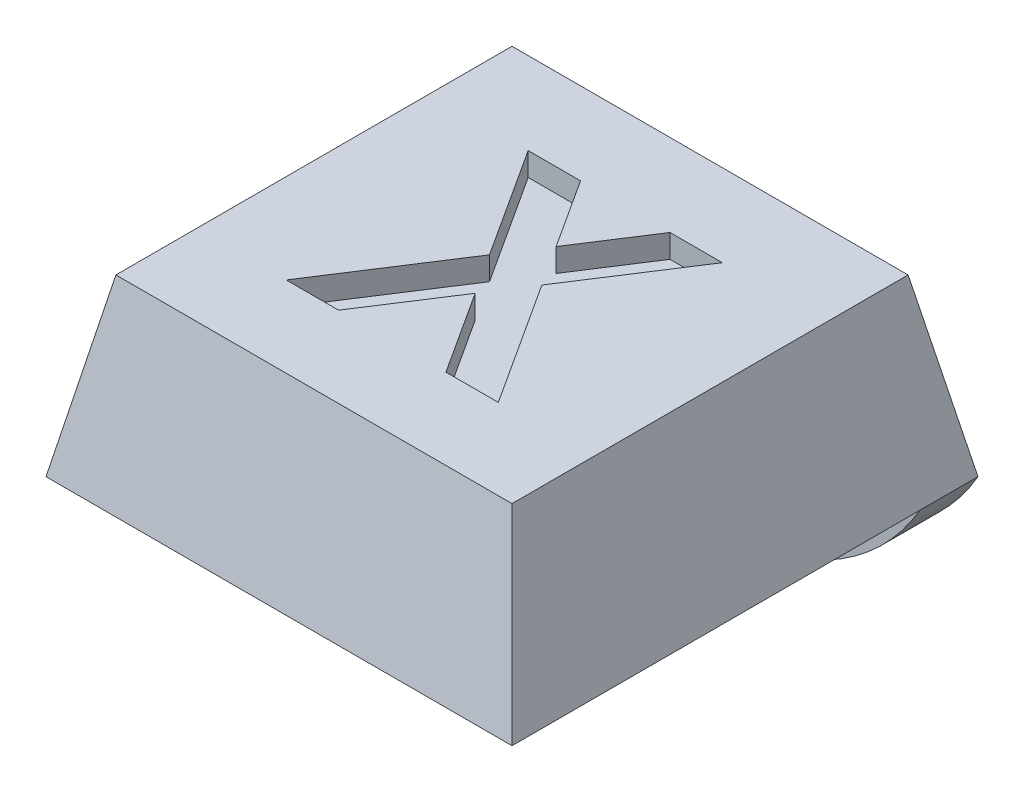
ISO-10303-21;
HEADER;
FILE_DESCRIPTION(('STEP AP214'),'2;1');
FILE_NAME('part.step','',(''),(''),'','','');
FILE_SCHEMA(('AUTOMOTIVE_DESIGN { 1 0 10303 214 1 1 1 1 }'));
ENDSEC;
DATA;
#1=APPLICATION_CONTEXT('core data for automotive mechanical design processes');
#2=APPLICATION_PROTOCOL_DEFINITION('international standard','automotive_design',2000,#1);
#3=PRODUCT_CONTEXT('',#1,'mechanical');
#4=PRODUCT('Part','Part','',(#3));
#5=PRODUCT_RELATED_PRODUCT_CATEGORY('part','',(#4));
#6=PRODUCT_DEFINITION_FORMATION('','',#4);
#7=PRODUCT_DEFINITION_CONTEXT('part definition',#1,'design');
#8=PRODUCT_DEFINITION('design','',#6,#7);
#9=PRODUCT_DEFINITION_SHAPE('','',#8);
#10=(LENGTH_UNIT() NAMED_UNIT(*) SI_UNIT(.MILLI.,.METRE.));
#11=(NAMED_UNIT(*) PLANE_ANGLE_UNIT() SI_UNIT($,.RADIAN.));
#12=(NAMED_UNIT(*) SI_UNIT($,.STERADIAN.) SOLID_ANGLE_UNIT());
#13=UNCERTAINTY_MEASURE_WITH_UNIT(LENGTH_MEASURE(1.E-05),#10,'distance_accuracy_value','');
#14=(GEOMETRIC_REPRESENTATION_CONTEXT(3) GLOBAL_UNCERTAINTY_ASSIGNED_CONTEXT((#13)) GLOBAL_UNIT_ASSIGNED_CONTEXT((#10,
#11,#12)) REPRESENTATION_CONTEXT('',''));
#15=CARTESIAN_POINT('',(0.,0.,0.));
#16=DIRECTION('',(0.,0.,1.));
#17=DIRECTION('',(1.,0.,0.));
#18=AXIS2_PLACEMENT_3D('',#15,#16,#17);
#19=CARTESIAN_POINT('',(0.,3.,0.));
#20=DIRECTION('',(0.,-1.,0.));
#21=DIRECTION('',(0.,0.,-1.));
#22=AXIS2_PLACEMENT_3D('',#19,#20,#21);
#23=PLANE('',#22);
#24=DIRECTION('',(-1.,0.,0.));
#25=VECTOR('',#24,1.);
#26=CARTESIAN_POINT('',(11.,3.,-0.6));
#27=LINE('',#26,#25);
#28=CARTESIAN_POINT('',(7.4,3.,-0.6));
#29=VERTEX_POINT('',#28);
#30=CARTESIAN_POINT('',(0.6,3.,-0.6));
#31=VERTEX_POINT('',#30);
#32=EDGE_CURVE('E230',#29,#31,#27,.T.);
#33=ORIENTED_EDGE('',*,*,#32,.F.);
#34=DIRECTION('',(0.,0.,1.));
#35=VECTOR('',#34,1.);
#36=CARTESIAN_POINT('',(7.4,3.,-8.));
#37=LINE('',#36,#35);
#38=CARTESIAN_POINT('',(7.4,3.,-7.4));
#39=VERTEX_POINT('',#38);
#40=EDGE_CURVE('E243',#39,#29,#37,.T.);
#41=ORIENTED_EDGE('',*,*,#40,.F.);
#42=DIRECTION('',(-1.,0.,0.));
#43=VECTOR('',#42,1.);
#44=CARTESIAN_POINT('',(11.,3.,-7.4));
#45=LINE('',#44,#43);
#46=CARTESIAN_POINT('',(0.599999999999999,3.,-7.4));
#47=VERTEX_POINT('',#46);
#48=EDGE_CURVE('E226',#39,#47,#45,.T.);
#49=ORIENTED_EDGE('',*,*,#48,.T.);
#50=DIRECTION('',(0.,0.,1.));
#51=VECTOR('',#50,1.);
#52=CARTESIAN_POINT('',(0.6,3.,-8.));
#53=LINE('',#52,#51);
#54=EDGE_CURVE('E246',#47,#31,#53,.T.);
#55=ORIENTED_EDGE('',*,*,#54,.T.);
#56=EDGE_LOOP('',(#33,#41,#49,#55));
#57=FACE_BOUND('',#56,.T.);
#58=DIRECTION('',(-1.,0.,0.));
#59=VECTOR('',#58,1.);
#60=CARTESIAN_POINT('',(3.03551556297444,3.,-1.98743460523464));
#61=LINE('',#60,#59);
#62=CARTESIAN_POINT('',(3.03551556297444,3.,-1.98743460523464));
#63=VERTEX_POINT('',#62);
#64=CARTESIAN_POINT('',(2.13647710143598,3.,-1.98743460523464));
#65=VERTEX_POINT('',#64);
#66=EDGE_CURVE('E59',#63,#65,#61,.T.);
#67=ORIENTED_EDGE('',*,*,#66,.T.);
#68=DIRECTION('',(0.543290774968153,0.,-0.839544599074107));
#69=VECTOR('',#68,1.);
#70=CARTESIAN_POINT('',(2.13647710143598,3.,-1.98743460523464));
#71=LINE('',#70,#69);
#72=CARTESIAN_POINT('',(3.50747069117957,3.,-4.10602434882438));
#73=VERTEX_POINT('',#72);
#74=EDGE_CURVE('E198',#65,#73,#71,.T.);
#75=ORIENTED_EDGE('',*,*,#74,.T.);
#76=DIRECTION('',(-0.543177141809505,0.,-0.839618123086714));
#77=VECTOR('',#76,1.);
#78=CARTESIAN_POINT('',(3.50747069117957,3.,-4.10602434882438));
#79=LINE('',#78,#77);
#80=CARTESIAN_POINT('',(2.29032325528213,3.,-5.98743460523464));
#81=VERTEX_POINT('',#80);
#82=EDGE_CURVE('E667',#73,#81,#79,.T.);
#83=ORIENTED_EDGE('',*,*,#82,.T.);
#84=DIRECTION('',(1.,0.,0.));
#85=VECTOR('',#84,1.);
#86=CARTESIAN_POINT('',(2.29032325528213,3.,-5.98743460523464));
#87=LINE('',#86,#85);
#88=CARTESIAN_POINT('',(3.18936171682059,3.,-5.98743460523464));
#89=VERTEX_POINT('',#88);
#90=EDGE_CURVE('E669',#81,#89,#87,.T.);
#91=ORIENTED_EDGE('',*,*,#90,.T.);
#92=DIRECTION('',(0.543133735363525,0.,0.839646202581816));
#93=VECTOR('',#92,1.);
#94=CARTESIAN_POINT('',(3.18936171682059,3.,-5.98743460523464));
#95=LINE('',#94,#93);
#96=CARTESIAN_POINT('',(3.9569899219488,3.,-4.80073588728592));
#97=VERTEX_POINT('',#96);
#98=EDGE_CURVE('E674',#89,#97,#95,.T.);
#99=ORIENTED_EDGE('',*,*,#98,.T.);
#100=DIRECTION('',(0.543133735363525,0.,-0.839646202581816));
#101=VECTOR('',#100,1.);
#102=CARTESIAN_POINT('',(3.9569899219488,3.,-4.80073588728592));
#103=LINE('',#102,#101);
#104=CARTESIAN_POINT('',(4.724618127077,3.,-5.98743460523464));
#105=VERTEX_POINT('',#104);
#106=EDGE_CURVE('E684',#97,#105,#103,.T.);
#107=ORIENTED_EDGE('',*,*,#106,.T.);
#108=DIRECTION('',(1.,0.,0.));
#109=VECTOR('',#108,1.);
#110=CARTESIAN_POINT('',(4.724618127077,3.,-5.98743460523464));
#111=LINE('',#110,#109);
#112=CARTESIAN_POINT('',(5.62365658861547,3.,-5.98743460523464));
#113=VERTEX_POINT('',#112);
#114=EDGE_CURVE('E688',#105,#113,#111,.T.);
#115=ORIENTED_EDGE('',*,*,#114,.T.);
#116=DIRECTION('',(-0.543177141809505,0.,0.839618123086714));
#117=VECTOR('',#116,1.);
#118=CARTESIAN_POINT('',(5.62365658861547,3.,-5.98743460523464));
#119=LINE('',#118,#117);
#120=CARTESIAN_POINT('',(4.40650915271803,3.,-4.10602434882438));
#121=VERTEX_POINT('',#120);
#122=EDGE_CURVE('E692',#113,#121,#119,.T.);
#123=ORIENTED_EDGE('',*,*,#122,.T.);
#124=DIRECTION('',(0.543290774968153,0.,0.839544599074107));
#125=VECTOR('',#124,1.);
#126=CARTESIAN_POINT('',(4.40650915271803,3.,-4.10602434882438));
#127=LINE('',#126,#125);
#128=CARTESIAN_POINT('',(5.77750274246162,3.,-1.98743460523464));
#129=VERTEX_POINT('',#128);
#130=EDGE_CURVE('E633',#121,#129,#127,.T.);
#131=ORIENTED_EDGE('',*,*,#130,.T.);
#132=DIRECTION('',(-1.,0.,0.));
#133=VECTOR('',#132,1.);
#134=CARTESIAN_POINT('',(5.77750274246162,3.,-1.98743460523464));
#135=LINE('',#134,#133);
#136=CARTESIAN_POINT('',(4.87846428092316,3.,-1.98743460523464));
#137=VERTEX_POINT('',#136);
#138=EDGE_CURVE('E628',#129,#137,#135,.T.);
#139=ORIENTED_EDGE('',*,*,#138,.T.);
#140=DIRECTION('',(-0.543310044190695,0.,-0.839532129153795));
#141=VECTOR('',#140,1.);
#142=CARTESIAN_POINT('',(4.87846428092316,3.,-1.98743460523464));
#143=LINE('',#142,#141);
#144=CARTESIAN_POINT('',(3.9569899219488,3.,-3.41131281036285));
#145=VERTEX_POINT('',#144);
#146=EDGE_CURVE('E622',#137,#145,#143,.T.);
#147=ORIENTED_EDGE('',*,*,#146,.T.);
#148=DIRECTION('',(-0.543310044190695,0.,0.839532129153795));
#149=VECTOR('',#148,1.);
#150=CARTESIAN_POINT('',(3.9569899219488,3.,-3.41131281036285));
#151=LINE('',#150,#149);
#152=EDGE_CURVE('E194',#145,#63,#151,.T.);
#153=ORIENTED_EDGE('',*,*,#152,.T.);
#154=EDGE_LOOP('',(#67,#75,#83,#91,#99,#107,#115,#123,#131,#139,#147,#153));
#155=FACE_BOUND('',#154,.T.);
#156=ADVANCED_FACE('F43',(#57,#155),#23,.F.);
#157=CARTESIAN_POINT('',(8.,0.,-8.));
#158=DIRECTION('',(-0.98058067569092,-0.196116135138184,0.));
#159=DIRECTION('',(0.196116135138184,-0.98058067569092,0.));
#160=AXIS2_PLACEMENT_3D('',#157,#158,#159);
#161=PLANE('',#160);
#162=DIRECTION('',(-0.192450089729875,0.962250448649376,-0.192450089729875));
#163=VECTOR('',#162,1.);
#164=CARTESIAN_POINT('',(7.7037037037037,1.48148148148148,-0.296296296296296));
#165=LINE('',#164,#163);
#166=CARTESIAN_POINT('',(8.,0.,0.));
#167=VERTEX_POINT('',#166);
#168=EDGE_CURVE('E240',#167,#29,#165,.T.);
#169=ORIENTED_EDGE('',*,*,#168,.F.);
#170=DIRECTION('',(0.,0.,-1.));
#171=VECTOR('',#170,1.);
#172=CARTESIAN_POINT('',(8.,0.,0.));
#173=LINE('',#172,#171);
#174=CARTESIAN_POINT('',(8.,0.,-7.));
#175=VERTEX_POINT('',#174);
#176=EDGE_CURVE('E259',#167,#175,#173,.T.);
#177=ORIENTED_EDGE('',*,*,#176,.T.);
#178=DIRECTION('',(0.,0.,1.));
#179=VECTOR('',#178,1.);
#180=CARTESIAN_POINT('',(8.,0.,-8.));
#181=LINE('',#180,#179);
#182=CARTESIAN_POINT('',(8.,0.,-8.));
#183=VERTEX_POINT('',#182);
#184=EDGE_CURVE('E200',#183,#175,#181,.T.);
#185=ORIENTED_EDGE('',*,*,#184,.F.);
#186=DIRECTION('',(0.192450089729875,-0.962250448649376,-0.192450089729875));
#187=VECTOR('',#186,1.);
#188=CARTESIAN_POINT('',(8.,0.,-8.));
#189=LINE('',#188,#187);
#190=EDGE_CURVE('E233',#39,#183,#189,.T.);
#191=ORIENTED_EDGE('',*,*,#190,.F.);
#192=ORIENTED_EDGE('',*,*,#40,.T.);
#193=EDGE_LOOP('',(#169,#177,#185,#191,#192));
#194=FACE_BOUND('',#193,.T.);
#195=ADVANCED_FACE('F327',(#194),#161,.F.);
#196=CARTESIAN_POINT('',(0.,0.,-8.));
#197=DIRECTION('',(0.98058067569092,-0.196116135138184,0.));
#198=DIRECTION('',(0.196116135138184,0.98058067569092,0.));
#199=AXIS2_PLACEMENT_3D('',#196,#197,#198);
#200=PLANE('',#199);
#201=DIRECTION('',(-0.192450089729875,-0.962250448649376,0.192450089729875));
#202=VECTOR('',#201,1.);
#203=CARTESIAN_POINT('',(0.296296296296296,1.48148148148148,-0.296296296296296));
#204=LINE('',#203,#202);
#205=CARTESIAN_POINT('',(0.,0.,0.));
#206=VERTEX_POINT('',#205);
#207=EDGE_CURVE('E287',#31,#206,#204,.T.);
#208=ORIENTED_EDGE('',*,*,#207,.F.);
#209=ORIENTED_EDGE('',*,*,#54,.F.);
#210=DIRECTION('',(0.192450089729875,0.962250448649376,0.192450089729875));
#211=VECTOR('',#210,1.);
#212=CARTESIAN_POINT('',(0.,0.,-8.));
#213=LINE('',#212,#211);
#214=CARTESIAN_POINT('',(0.,0.,-8.));
#215=VERTEX_POINT('',#214);
#216=EDGE_CURVE('E258',#215,#47,#213,.T.);
#217=ORIENTED_EDGE('',*,*,#216,.F.);
#218=DIRECTION('',(0.,0.,1.));
#219=VECTOR('',#218,1.);
#220=CARTESIAN_POINT('',(0.,0.,0.));
#221=LINE('',#220,#219);
#222=CARTESIAN_POINT('',(0.,0.,-7.));
#223=VERTEX_POINT('',#222);
#224=EDGE_CURVE('E263',#215,#223,#221,.T.);
#225=ORIENTED_EDGE('',*,*,#224,.T.);
#226=EDGE_CURVE('E250',#223,#206,#221,.T.);
#227=ORIENTED_EDGE('',*,*,#226,.T.);
#228=EDGE_LOOP('',(#208,#209,#217,#225,#227));
#229=FACE_BOUND('',#228,.T.);
#230=ADVANCED_FACE('F311',(#229),#200,.F.);
#231=CARTESIAN_POINT('',(0.,0.,0.));
#232=DIRECTION('',(0.,-1.,0.));
#233=DIRECTION('',(0.,0.,-1.));
#234=AXIS2_PLACEMENT_3D('',#231,#232,#233);
#235=PLANE('',#234);
#236=DIRECTION('',(-1.,0.,0.));
#237=VECTOR('',#236,1.);
#238=CARTESIAN_POINT('',(0.,0.,-7.));
#239=LINE('',#238,#237);
#240=EDGE_CURVE('E206',#175,#223,#239,.T.);
#241=ORIENTED_EDGE('',*,*,#240,.F.);
#242=ORIENTED_EDGE('',*,*,#176,.F.);
#243=DIRECTION('',(1.,0.,0.));
#244=VECTOR('',#243,1.);
#245=CARTESIAN_POINT('',(0.,0.,0.));
#246=LINE('',#245,#244);
#247=EDGE_CURVE('E260',#206,#167,#246,.T.);
#248=ORIENTED_EDGE('',*,*,#247,.F.);
#249=ORIENTED_EDGE('',*,*,#226,.F.);
#250=EDGE_LOOP('',(#241,#242,#248,#249));
#251=FACE_BOUND('',#250,.T.);
#252=CARTESIAN_POINT('',(4.,0.,-3.75));
#253=DIRECTION('',(0.,-1.,0.));
#254=DIRECTION('',(0.,0.,-1.));
#255=AXIS2_PLACEMENT_3D('',#252,#253,#254);
#256=CIRCLE('',#255,1.75);
#257=CARTESIAN_POINT('',(4.,0.,-5.5));
#258=VERTEX_POINT('',#257);
#259=EDGE_CURVE('E218',#258,#258,#256,.T.);
#260=ORIENTED_EDGE('',*,*,#259,.F.);
#261=EDGE_LOOP('',(#260));
#262=FACE_BOUND('',#261,.T.);
#263=ADVANCED_FACE('F322',(#251,#262),#235,.T.);
#264=CARTESIAN_POINT('',(11.,3.,-7.4));
#265=DIRECTION('',(0.,0.196116135138184,-0.98058067569092));
#266=DIRECTION('',(0.,0.98058067569092,0.196116135138184));
#267=AXIS2_PLACEMENT_3D('',#264,#265,#266);
#268=PLANE('',#267);
#269=ORIENTED_EDGE('',*,*,#190,.T.);
#270=DIRECTION('',(-1.,0.,0.));
#271=VECTOR('',#270,1.);
#272=CARTESIAN_POINT('',(0.,0.,-8.));
#273=LINE('',#272,#271);
#274=EDGE_CURVE('E254',#183,#215,#273,.T.);
#275=ORIENTED_EDGE('',*,*,#274,.T.);
#276=ORIENTED_EDGE('',*,*,#216,.T.);
#277=ORIENTED_EDGE('',*,*,#48,.F.);
#278=EDGE_LOOP('',(#269,#275,#276,#277));
#279=FACE_BOUND('',#278,.T.);
#280=ADVANCED_FACE('F306',(#279),#268,.T.);
#281=CARTESIAN_POINT('',(11.,0.,0.));
#282=DIRECTION('',(0.,0.196116135138184,0.98058067569092));
#283=DIRECTION('',(0.,-0.98058067569092,0.196116135138184));
#284=AXIS2_PLACEMENT_3D('',#281,#282,#283);
#285=PLANE('',#284);
#286=ORIENTED_EDGE('',*,*,#168,.T.);
#287=ORIENTED_EDGE('',*,*,#32,.T.);
#288=ORIENTED_EDGE('',*,*,#207,.T.);
#289=ORIENTED_EDGE('',*,*,#247,.T.);
#290=EDGE_LOOP('',(#286,#287,#288,#289));
#291=FACE_BOUND('',#290,.T.);
#292=ADVANCED_FACE('F351',(#291),#285,.T.);
#293=CARTESIAN_POINT('',(4.,0.4,-3.75));
#294=DIRECTION('',(0.,-1.,0.));
#295=DIRECTION('',(0.,0.,-1.));
#296=AXIS2_PLACEMENT_3D('',#293,#294,#295);
#297=CYLINDRICAL_SURFACE('',#296,1.75);
#298=CARTESIAN_POINT('',(4.,0.4,-3.75));
#299=DIRECTION('',(0.,-1.,0.));
#300=DIRECTION('',(0.,0.,-1.));
#301=AXIS2_PLACEMENT_3D('',#298,#299,#300);
#302=CIRCLE('',#301,1.75);
#303=CARTESIAN_POINT('',(4.,0.4,-5.5));
#304=VERTEX_POINT('',#303);
#305=EDGE_CURVE('E222',#304,#304,#302,.T.);
#306=ORIENTED_EDGE('',*,*,#305,.F.);
#307=EDGE_LOOP('',(#306));
#308=FACE_BOUND('',#307,.T.);
#309=ORIENTED_EDGE('',*,*,#259,.T.);
#310=EDGE_LOOP('',(#309));
#311=FACE_BOUND('',#310,.T.);
#312=ADVANCED_FACE('F358',(#308,#311),#297,.F.);
#313=CARTESIAN_POINT('',(4.,0.4,-3.75));
#314=DIRECTION('',(0.,-1.,0.));
#315=DIRECTION('',(0.,0.,-1.));
#316=AXIS2_PLACEMENT_3D('',#313,#314,#315);
#317=PLANE('',#316);
#318=ORIENTED_EDGE('',*,*,#305,.T.);
#319=EDGE_LOOP('',(#318));
#320=FACE_BOUND('',#319,.T.);
#321=ADVANCED_FACE('F362',(#320),#317,.T.);
#322=CARTESIAN_POINT('',(0.,-2.,-8.));
#323=DIRECTION('',(0.,0.,1.));
#324=DIRECTION('',(1.,0.,0.));
#325=AXIS2_PLACEMENT_3D('',#322,#323,#324);
#326=PLANE('',#325);
#327=ORIENTED_EDGE('',*,*,#274,.F.);
#328=CARTESIAN_POINT('',(4.53589838486225,2.,-8.));
#329=DIRECTION('',(0.,0.,1.));
#330=DIRECTION('',(1.,0.,0.));
#331=AXIS2_PLACEMENT_3D('',#328,#329,#330);
#332=CIRCLE('',#331,4.);
#333=CARTESIAN_POINT('',(4.53589838486225,-2.,-8.));
#334=VERTEX_POINT('',#333);
#335=EDGE_CURVE('E11',#183,#334,#332,.F.);
#336=ORIENTED_EDGE('',*,*,#335,.T.);
#337=DIRECTION('',(1.,0.,0.));
#338=VECTOR('',#337,1.);
#339=CARTESIAN_POINT('',(0.,-2.,-8.));
#340=LINE('',#339,#338);
#341=CARTESIAN_POINT('',(3.46410161513775,-2.,-8.));
#342=VERTEX_POINT('',#341);
#343=EDGE_CURVE('E212',#342,#334,#340,.T.);
#344=ORIENTED_EDGE('',*,*,#343,.F.);
#345=CARTESIAN_POINT('',(3.46410161513775,2.,-8.));
#346=DIRECTION('',(0.,0.,1.));
#347=DIRECTION('',(1.,0.,0.));
#348=AXIS2_PLACEMENT_3D('',#345,#346,#347);
#349=CIRCLE('',#348,4.);
#350=EDGE_CURVE('E52',#342,#215,#349,.F.);
#351=ORIENTED_EDGE('',*,*,#350,.T.);
#352=EDGE_LOOP('',(#327,#336,#344,#351));
#353=FACE_BOUND('',#352,.T.);
#354=ADVANCED_FACE('F299',(#353),#326,.F.);
#355=CARTESIAN_POINT('',(0.,-2.,-7.));
#356=DIRECTION('',(0.,0.,-1.));
#357=DIRECTION('',(-1.,0.,0.));
#358=AXIS2_PLACEMENT_3D('',#355,#356,#357);
#359=PLANE('',#358);
#360=DIRECTION('',(-1.,0.,0.));
#361=VECTOR('',#360,1.);
#362=CARTESIAN_POINT('',(0.,-2.,-7.));
#363=LINE('',#362,#361);
#364=CARTESIAN_POINT('',(4.53589838486225,-2.,-7.));
#365=VERTEX_POINT('',#364);
#366=CARTESIAN_POINT('',(3.46410161513775,-2.,-7.));
#367=VERTEX_POINT('',#366);
#368=EDGE_CURVE('E216',#365,#367,#363,.T.);
#369=ORIENTED_EDGE('',*,*,#368,.F.);
#370=CARTESIAN_POINT('',(4.53589838486225,2.,-7.));
#371=DIRECTION('',(0.,0.,-1.));
#372=DIRECTION('',(-1.,0.,0.));
#373=AXIS2_PLACEMENT_3D('',#370,#371,#372);
#374=CIRCLE('',#373,4.);
#375=EDGE_CURVE('E293',#365,#175,#374,.F.);
#376=ORIENTED_EDGE('',*,*,#375,.T.);
#377=ORIENTED_EDGE('',*,*,#240,.T.);
#378=CARTESIAN_POINT('',(3.46410161513775,2.,-7.));
#379=DIRECTION('',(0.,0.,-1.));
#380=DIRECTION('',(-1.,0.,0.));
#381=AXIS2_PLACEMENT_3D('',#378,#379,#380);
#382=CIRCLE('',#381,4.);
#383=EDGE_CURVE('E67',#223,#367,#382,.F.);
#384=ORIENTED_EDGE('',*,*,#383,.T.);
#385=EDGE_LOOP('',(#369,#376,#377,#384));
#386=FACE_BOUND('',#385,.T.);
#387=ADVANCED_FACE('F317',(#386),#359,.F.);
#388=CARTESIAN_POINT('',(0.,-2.,0.));
#389=DIRECTION('',(0.,1.,0.));
#390=DIRECTION('',(0.,0.,1.));
#391=AXIS2_PLACEMENT_3D('',#388,#389,#390);
#392=PLANE('',#391);
#393=ORIENTED_EDGE('',*,*,#343,.T.);
#394=DIRECTION('',(0.,0.,1.));
#395=VECTOR('',#394,1.);
#396=CARTESIAN_POINT('',(4.53589838486225,-2.,0.));
#397=LINE('',#396,#395);
#398=EDGE_CURVE('E286',#334,#365,#397,.T.);
#399=ORIENTED_EDGE('',*,*,#398,.T.);
#400=ORIENTED_EDGE('',*,*,#368,.T.);
#401=DIRECTION('',(0.,0.,-1.));
#402=VECTOR('',#401,1.);
#403=CARTESIAN_POINT('',(3.46410161513775,-2.,0.));
#404=LINE('',#403,#402);
#405=EDGE_CURVE('E282',#367,#342,#404,.T.);
#406=ORIENTED_EDGE('',*,*,#405,.T.);
#407=EDGE_LOOP('',(#393,#399,#400,#406));
#408=FACE_BOUND('',#407,.T.);
#409=ADVANCED_FACE('F315',(#408),#392,.F.);
#410=CARTESIAN_POINT('',(4.53589838486225,2.,-8.));
#411=DIRECTION('',(0.,0.,1.));
#412=DIRECTION('',(1.,0.,0.));
#413=AXIS2_PLACEMENT_3D('',#410,#411,#412);
#414=CYLINDRICAL_SURFACE('',#413,4.);
#415=ORIENTED_EDGE('',*,*,#335,.F.);
#416=ORIENTED_EDGE('',*,*,#184,.T.);
#417=ORIENTED_EDGE('',*,*,#375,.F.);
#418=ORIENTED_EDGE('',*,*,#398,.F.);
#419=EDGE_LOOP('',(#415,#416,#417,#418));
#420=FACE_BOUND('',#419,.T.);
#421=ADVANCED_FACE('F328',(#420),#414,.T.);
#422=CARTESIAN_POINT('',(3.46410161513775,2.,-8.));
#423=DIRECTION('',(0.,0.,-1.));
#424=DIRECTION('',(-1.,0.,0.));
#425=AXIS2_PLACEMENT_3D('',#422,#423,#424);
#426=CYLINDRICAL_SURFACE('',#425,4.);
#427=ORIENTED_EDGE('',*,*,#383,.F.);
#428=ORIENTED_EDGE('',*,*,#224,.F.);
#429=ORIENTED_EDGE('',*,*,#350,.F.);
#430=ORIENTED_EDGE('',*,*,#405,.F.);
#431=EDGE_LOOP('',(#427,#428,#429,#430));
#432=FACE_BOUND('',#431,.T.);
#433=ADVANCED_FACE('F45',(#432),#426,.T.);
#434=CARTESIAN_POINT('',(3.03551556297444,2.6,-1.98743460523464));
#435=DIRECTION('',(0.,0.,-1.));
#436=DIRECTION('',(-1.,0.,0.));
#437=AXIS2_PLACEMENT_3D('',#434,#435,#436);
#438=PLANE('',#437);
#439=ORIENTED_EDGE('',*,*,#66,.F.);
#440=DIRECTION('',(0.,1.,0.));
#441=VECTOR('',#440,1.);
#442=CARTESIAN_POINT('',(3.03551556297444,2.6,-1.98743460523464));
#443=LINE('',#442,#441);
#444=CARTESIAN_POINT('',(3.03551556297444,2.6,-1.98743460523464));
#445=VERTEX_POINT('',#444);
#446=EDGE_CURVE('E192',#445,#63,#443,.T.);
#447=ORIENTED_EDGE('',*,*,#446,.F.);
#448=DIRECTION('',(-1.,0.,0.));
#449=VECTOR('',#448,1.);
#450=CARTESIAN_POINT('',(3.03551556297444,2.6,-1.98743460523464));
#451=LINE('',#450,#449);
#452=CARTESIAN_POINT('',(2.13647710143598,2.6,-1.98743460523464));
#453=VERTEX_POINT('',#452);
#454=EDGE_CURVE('E182',#445,#453,#451,.T.);
#455=ORIENTED_EDGE('',*,*,#454,.T.);
#456=DIRECTION('',(0.,1.,0.));
#457=VECTOR('',#456,1.);
#458=CARTESIAN_POINT('',(2.13647710143598,2.6,-1.98743460523464));
#459=LINE('',#458,#457);
#460=EDGE_CURVE('E191',#453,#65,#459,.T.);
#461=ORIENTED_EDGE('',*,*,#460,.T.);
#462=EDGE_LOOP('',(#439,#447,#455,#461));
#463=FACE_BOUND('',#462,.T.);
#464=ADVANCED_FACE('F190',(#463),#438,.T.);
#465=CARTESIAN_POINT('',(2.13647710143598,2.6,-1.98743460523464));
#466=DIRECTION('',(0.839544599074107,0.,0.543290774968153));
#467=DIRECTION('',(0.543290774968153,0.,-0.839544599074107));
#468=AXIS2_PLACEMENT_3D('',#465,#466,#467);
#469=PLANE('',#468);
#470=ORIENTED_EDGE('',*,*,#74,.F.);
#471=ORIENTED_EDGE('',*,*,#460,.F.);
#472=DIRECTION('',(0.543290774968153,0.,-0.839544599074107));
#473=VECTOR('',#472,1.);
#474=CARTESIAN_POINT('',(2.13647710143598,2.6,-1.98743460523464));
#475=LINE('',#474,#473);
#476=CARTESIAN_POINT('',(3.50747069117957,2.6,-4.10602434882438));
#477=VERTEX_POINT('',#476);
#478=EDGE_CURVE('E178',#453,#477,#475,.T.);
#479=ORIENTED_EDGE('',*,*,#478,.T.);
#480=DIRECTION('',(0.,1.,0.));
#481=VECTOR('',#480,1.);
#482=CARTESIAN_POINT('',(3.50747069117957,2.6,-4.10602434882438));
#483=LINE('',#482,#481);
#484=EDGE_CURVE('E201',#477,#73,#483,.T.);
#485=ORIENTED_EDGE('',*,*,#484,.T.);
#486=EDGE_LOOP('',(#470,#471,#479,#485));
#487=FACE_BOUND('',#486,.T.);
#488=ADVANCED_FACE('F196',(#487),#469,.T.);
#489=CARTESIAN_POINT('',(3.50747069117957,2.6,-4.10602434882438));
#490=DIRECTION('',(0.839618123086714,0.,-0.543177141809505));
#491=DIRECTION('',(-0.543177141809505,0.,-0.839618123086714));
#492=AXIS2_PLACEMENT_3D('',#489,#490,#491);
#493=PLANE('',#492);
#494=ORIENTED_EDGE('',*,*,#82,.F.);
#495=ORIENTED_EDGE('',*,*,#484,.F.);
#496=DIRECTION('',(-0.543177141809505,0.,-0.839618123086714));
#497=VECTOR('',#496,1.);
#498=CARTESIAN_POINT('',(3.50747069117957,2.6,-4.10602434882438));
#499=LINE('',#498,#497);
#500=CARTESIAN_POINT('',(2.29032325528213,2.6,-5.98743460523464));
#501=VERTEX_POINT('',#500);
#502=EDGE_CURVE('E184',#477,#501,#499,.T.);
#503=ORIENTED_EDGE('',*,*,#502,.T.);
#504=DIRECTION('',(0.,1.,0.));
#505=VECTOR('',#504,1.);
#506=CARTESIAN_POINT('',(2.29032325528213,2.6,-5.98743460523464));
#507=LINE('',#506,#505);
#508=EDGE_CURVE('E208',#501,#81,#507,.T.);
#509=ORIENTED_EDGE('',*,*,#508,.T.);
#510=EDGE_LOOP('',(#494,#495,#503,#509));
#511=FACE_BOUND('',#510,.T.);
#512=ADVANCED_FACE('F375',(#511),#493,.T.);
#513=CARTESIAN_POINT('',(2.29032325528213,2.6,-5.98743460523464));
#514=DIRECTION('',(0.,0.,1.));
#515=DIRECTION('',(1.,0.,0.));
#516=AXIS2_PLACEMENT_3D('',#513,#514,#515);
#517=PLANE('',#516);
#518=ORIENTED_EDGE('',*,*,#90,.F.);
#519=ORIENTED_EDGE('',*,*,#508,.F.);
#520=DIRECTION('',(1.,0.,0.));
#521=VECTOR('',#520,1.);
#522=CARTESIAN_POINT('',(2.29032325528213,2.6,-5.98743460523464));
#523=LINE('',#522,#521);
#524=CARTESIAN_POINT('',(3.18936171682059,2.6,-5.98743460523464));
#525=VERTEX_POINT('',#524);
#526=EDGE_CURVE('E728',#501,#525,#523,.T.);
#527=ORIENTED_EDGE('',*,*,#526,.T.);
#528=DIRECTION('',(0.,1.,0.));
#529=VECTOR('',#528,1.);
#530=CARTESIAN_POINT('',(3.18936171682059,2.6,-5.98743460523464));
#531=LINE('',#530,#529);
#532=EDGE_CURVE('E660',#525,#89,#531,.T.);
#533=ORIENTED_EDGE('',*,*,#532,.T.);
#534=EDGE_LOOP('',(#518,#519,#527,#533));
#535=FACE_BOUND('',#534,.T.);
#536=ADVANCED_FACE('F378',(#535),#517,.T.);
#537=CARTESIAN_POINT('',(3.18936171682059,2.6,-5.98743460523464));
#538=DIRECTION('',(-0.839646202581816,0.,0.543133735363525));
#539=DIRECTION('',(0.543133735363525,0.,0.839646202581816));
#540=AXIS2_PLACEMENT_3D('',#537,#538,#539);
#541=PLANE('',#540);
#542=ORIENTED_EDGE('',*,*,#98,.F.);
#543=ORIENTED_EDGE('',*,*,#532,.F.);
#544=DIRECTION('',(0.543133735363525,0.,0.839646202581816));
#545=VECTOR('',#544,1.);
#546=CARTESIAN_POINT('',(3.18936171682059,2.6,-5.98743460523464));
#547=LINE('',#546,#545);
#548=CARTESIAN_POINT('',(3.9569899219488,2.6,-4.80073588728592));
#549=VERTEX_POINT('',#548);
#550=EDGE_CURVE('E725',#525,#549,#547,.T.);
#551=ORIENTED_EDGE('',*,*,#550,.T.);
#552=DIRECTION('',(0.,1.,0.));
#553=VECTOR('',#552,1.);
#554=CARTESIAN_POINT('',(3.9569899219488,2.6,-4.80073588728592));
#555=LINE('',#554,#553);
#556=EDGE_CURVE('E657',#549,#97,#555,.T.);
#557=ORIENTED_EDGE('',*,*,#556,.T.);
#558=EDGE_LOOP('',(#542,#543,#551,#557));
#559=FACE_BOUND('',#558,.T.);
#560=ADVANCED_FACE('F382',(#559),#541,.T.);
#561=CARTESIAN_POINT('',(3.9569899219488,2.6,-4.80073588728592));
#562=DIRECTION('',(0.839646202581816,0.,0.543133735363525));
#563=DIRECTION('',(0.543133735363525,0.,-0.839646202581816));
#564=AXIS2_PLACEMENT_3D('',#561,#562,#563);
#565=PLANE('',#564);
#566=ORIENTED_EDGE('',*,*,#106,.F.);
#567=ORIENTED_EDGE('',*,*,#556,.F.);
#568=DIRECTION('',(0.543133735363525,0.,-0.839646202581816));
#569=VECTOR('',#568,1.);
#570=CARTESIAN_POINT('',(3.9569899219488,2.6,-4.80073588728592));
#571=LINE('',#570,#569);
#572=CARTESIAN_POINT('',(4.724618127077,2.6,-5.98743460523464));
#573=VERTEX_POINT('',#572);
#574=EDGE_CURVE('E722',#549,#573,#571,.T.);
#575=ORIENTED_EDGE('',*,*,#574,.T.);
#576=DIRECTION('',(0.,1.,0.));
#577=VECTOR('',#576,1.);
#578=CARTESIAN_POINT('',(4.724618127077,2.6,-5.98743460523464));
#579=LINE('',#578,#577);
#580=EDGE_CURVE('E654',#573,#105,#579,.T.);
#581=ORIENTED_EDGE('',*,*,#580,.T.);
#582=EDGE_LOOP('',(#566,#567,#575,#581));
#583=FACE_BOUND('',#582,.T.);
#584=ADVANCED_FACE('F386',(#583),#565,.T.);
#585=CARTESIAN_POINT('',(4.724618127077,2.6,-5.98743460523464));
#586=DIRECTION('',(0.,0.,1.));
#587=DIRECTION('',(1.,0.,0.));
#588=AXIS2_PLACEMENT_3D('',#585,#586,#587);
#589=PLANE('',#588);
#590=ORIENTED_EDGE('',*,*,#114,.F.);
#591=ORIENTED_EDGE('',*,*,#580,.F.);
#592=DIRECTION('',(1.,0.,0.));
#593=VECTOR('',#592,1.);
#594=CARTESIAN_POINT('',(4.724618127077,2.6,-5.98743460523464));
#595=LINE('',#594,#593);
#596=CARTESIAN_POINT('',(5.62365658861547,2.6,-5.98743460523464));
#597=VERTEX_POINT('',#596);
#598=EDGE_CURVE('E719',#573,#597,#595,.T.);
#599=ORIENTED_EDGE('',*,*,#598,.T.);
#600=DIRECTION('',(0.,1.,0.));
#601=VECTOR('',#600,1.);
#602=CARTESIAN_POINT('',(5.62365658861547,2.6,-5.98743460523464));
#603=LINE('',#602,#601);
#604=EDGE_CURVE('E651',#597,#113,#603,.T.);
#605=ORIENTED_EDGE('',*,*,#604,.T.);
#606=EDGE_LOOP('',(#590,#591,#599,#605));
#607=FACE_BOUND('',#606,.T.);
#608=ADVANCED_FACE('F390',(#607),#589,.T.);
#609=CARTESIAN_POINT('',(5.62365658861547,2.6,-5.98743460523464));
#610=DIRECTION('',(-0.839618123086714,0.,-0.543177141809505));
#611=DIRECTION('',(-0.543177141809505,0.,0.839618123086714));
#612=AXIS2_PLACEMENT_3D('',#609,#610,#611);
#613=PLANE('',#612);
#614=ORIENTED_EDGE('',*,*,#122,.F.);
#615=ORIENTED_EDGE('',*,*,#604,.F.);
#616=DIRECTION('',(-0.543177141809505,0.,0.839618123086714));
#617=VECTOR('',#616,1.);
#618=CARTESIAN_POINT('',(5.62365658861547,2.6,-5.98743460523464));
#619=LINE('',#618,#617);
#620=CARTESIAN_POINT('',(4.40650915271803,2.6,-4.10602434882438));
#621=VERTEX_POINT('',#620);
#622=EDGE_CURVE('E716',#597,#621,#619,.T.);
#623=ORIENTED_EDGE('',*,*,#622,.T.);
#624=DIRECTION('',(0.,1.,0.));
#625=VECTOR('',#624,1.);
#626=CARTESIAN_POINT('',(4.40650915271803,2.6,-4.10602434882438));
#627=LINE('',#626,#625);
#628=EDGE_CURVE('E648',#621,#121,#627,.T.);
#629=ORIENTED_EDGE('',*,*,#628,.T.);
#630=EDGE_LOOP('',(#614,#615,#623,#629));
#631=FACE_BOUND('',#630,.T.);
#632=ADVANCED_FACE('F394',(#631),#613,.T.);
#633=CARTESIAN_POINT('',(4.40650915271803,2.6,-4.10602434882438));
#634=DIRECTION('',(-0.839544599074107,0.,0.543290774968153));
#635=DIRECTION('',(0.543290774968153,0.,0.839544599074107));
#636=AXIS2_PLACEMENT_3D('',#633,#634,#635);
#637=PLANE('',#636);
#638=ORIENTED_EDGE('',*,*,#130,.F.);
#639=ORIENTED_EDGE('',*,*,#628,.F.);
#640=DIRECTION('',(0.543290774968153,0.,0.839544599074107));
#641=VECTOR('',#640,1.);
#642=CARTESIAN_POINT('',(4.40650915271803,2.6,-4.10602434882438));
#643=LINE('',#642,#641);
#644=CARTESIAN_POINT('',(5.77750274246162,2.6,-1.98743460523464));
#645=VERTEX_POINT('',#644);
#646=EDGE_CURVE('E701',#621,#645,#643,.T.);
#647=ORIENTED_EDGE('',*,*,#646,.T.);
#648=DIRECTION('',(0.,1.,0.));
#649=VECTOR('',#648,1.);
#650=CARTESIAN_POINT('',(5.77750274246162,2.6,-1.98743460523464));
#651=LINE('',#650,#649);
#652=EDGE_CURVE('E645',#645,#129,#651,.T.);
#653=ORIENTED_EDGE('',*,*,#652,.T.);
#654=EDGE_LOOP('',(#638,#639,#647,#653));
#655=FACE_BOUND('',#654,.T.);
#656=ADVANCED_FACE('F398',(#655),#637,.T.);
#657=CARTESIAN_POINT('',(5.77750274246162,2.6,-1.98743460523464));
#658=DIRECTION('',(0.,0.,-1.));
#659=DIRECTION('',(-1.,0.,0.));
#660=AXIS2_PLACEMENT_3D('',#657,#658,#659);
#661=PLANE('',#660);
#662=ORIENTED_EDGE('',*,*,#138,.F.);
#663=ORIENTED_EDGE('',*,*,#652,.F.);
#664=DIRECTION('',(-1.,0.,0.));
#665=VECTOR('',#664,1.);
#666=CARTESIAN_POINT('',(5.77750274246162,2.6,-1.98743460523464));
#667=LINE('',#666,#665);
#668=CARTESIAN_POINT('',(4.87846428092316,2.6,-1.98743460523464));
#669=VERTEX_POINT('',#668);
#670=EDGE_CURVE('E703',#645,#669,#667,.T.);
#671=ORIENTED_EDGE('',*,*,#670,.T.);
#672=DIRECTION('',(0.,1.,0.));
#673=VECTOR('',#672,1.);
#674=CARTESIAN_POINT('',(4.87846428092316,2.6,-1.98743460523464));
#675=LINE('',#674,#673);
#676=EDGE_CURVE('E642',#669,#137,#675,.T.);
#677=ORIENTED_EDGE('',*,*,#676,.T.);
#678=EDGE_LOOP('',(#662,#663,#671,#677));
#679=FACE_BOUND('',#678,.T.);
#680=ADVANCED_FACE('F402',(#679),#661,.T.);
#681=CARTESIAN_POINT('',(4.87846428092316,2.6,-1.98743460523464));
#682=DIRECTION('',(0.839532129153795,0.,-0.543310044190695));
#683=DIRECTION('',(-0.543310044190695,0.,-0.839532129153796));
#684=AXIS2_PLACEMENT_3D('',#681,#682,#683);
#685=PLANE('',#684);
#686=ORIENTED_EDGE('',*,*,#146,.F.);
#687=ORIENTED_EDGE('',*,*,#676,.F.);
#688=DIRECTION('',(-0.543310044190695,0.,-0.839532129153795));
#689=VECTOR('',#688,1.);
#690=CARTESIAN_POINT('',(4.87846428092316,2.6,-1.98743460523464));
#691=LINE('',#690,#689);
#692=CARTESIAN_POINT('',(3.9569899219488,2.6,-3.41131281036285));
#693=VERTEX_POINT('',#692);
#694=EDGE_CURVE('E705',#669,#693,#691,.T.);
#695=ORIENTED_EDGE('',*,*,#694,.T.);
#696=DIRECTION('',(0.,1.,0.));
#697=VECTOR('',#696,1.);
#698=CARTESIAN_POINT('',(3.9569899219488,2.6,-3.41131281036285));
#699=LINE('',#698,#697);
#700=EDGE_CURVE('E620',#693,#145,#699,.T.);
#701=ORIENTED_EDGE('',*,*,#700,.T.);
#702=EDGE_LOOP('',(#686,#687,#695,#701));
#703=FACE_BOUND('',#702,.T.);
#704=ADVANCED_FACE('F406',(#703),#685,.T.);
#705=CARTESIAN_POINT('',(3.9569899219488,2.6,-3.41131281036285));
#706=DIRECTION('',(-0.839532129153795,0.,-0.543310044190695));
#707=DIRECTION('',(-0.543310044190695,0.,0.839532129153796));
#708=AXIS2_PLACEMENT_3D('',#705,#706,#707);
#709=PLANE('',#708);
#710=ORIENTED_EDGE('',*,*,#152,.F.);
#711=ORIENTED_EDGE('',*,*,#700,.F.);
#712=DIRECTION('',(-0.543310044190695,0.,0.839532129153795));
#713=VECTOR('',#712,1.);
#714=CARTESIAN_POINT('',(3.9569899219488,2.6,-3.41131281036285));
#715=LINE('',#714,#713);
#716=EDGE_CURVE('E639',#693,#445,#715,.T.);
#717=ORIENTED_EDGE('',*,*,#716,.T.);
#718=ORIENTED_EDGE('',*,*,#446,.T.);
#719=EDGE_LOOP('',(#710,#711,#717,#718));
#720=FACE_BOUND('',#719,.T.);
#721=ADVANCED_FACE('F410',(#720),#709,.T.);
#722=CARTESIAN_POINT('',(0.,2.6,0.));
#723=DIRECTION('',(0.,1.,0.));
#724=DIRECTION('',(0.,0.,1.));
#725=AXIS2_PLACEMENT_3D('',#722,#723,#724);
#726=PLANE('',#725);
#727=ORIENTED_EDGE('',*,*,#454,.F.);
#728=ORIENTED_EDGE('',*,*,#716,.F.);
#729=ORIENTED_EDGE('',*,*,#694,.F.);
#730=ORIENTED_EDGE('',*,*,#670,.F.);
#731=ORIENTED_EDGE('',*,*,#646,.F.);
#732=ORIENTED_EDGE('',*,*,#622,.F.);
#733=ORIENTED_EDGE('',*,*,#598,.F.);
#734=ORIENTED_EDGE('',*,*,#574,.F.);
#735=ORIENTED_EDGE('',*,*,#550,.F.);
#736=ORIENTED_EDGE('',*,*,#526,.F.);
#737=ORIENTED_EDGE('',*,*,#502,.F.);
#738=ORIENTED_EDGE('',*,*,#478,.F.);
#739=EDGE_LOOP('',(#727,#728,#729,#730,#731,#732,#733,#734,#735,#736,#737,#738));
#740=FACE_BOUND('',#739,.T.);
#741=ADVANCED_FACE('F180',(#740),#726,.T.);
#742=CLOSED_SHELL('',(#156,#195,#230,#263,#280,#292,#312,#321,#354,#387,#409,#421,#433,#464,
#488,#512,#536,#560,#584,#608,#632,#656,#680,#704,#721,#741));
#743=MANIFOLD_SOLID_BREP('B2',#742);
#744=ADVANCED_BREP_SHAPE_REPRESENTATION('',(#18,#743),#14);
#745=SHAPE_DEFINITION_REPRESENTATION(#9,#744);
ENDSEC;
END-ISO-10303-21;
